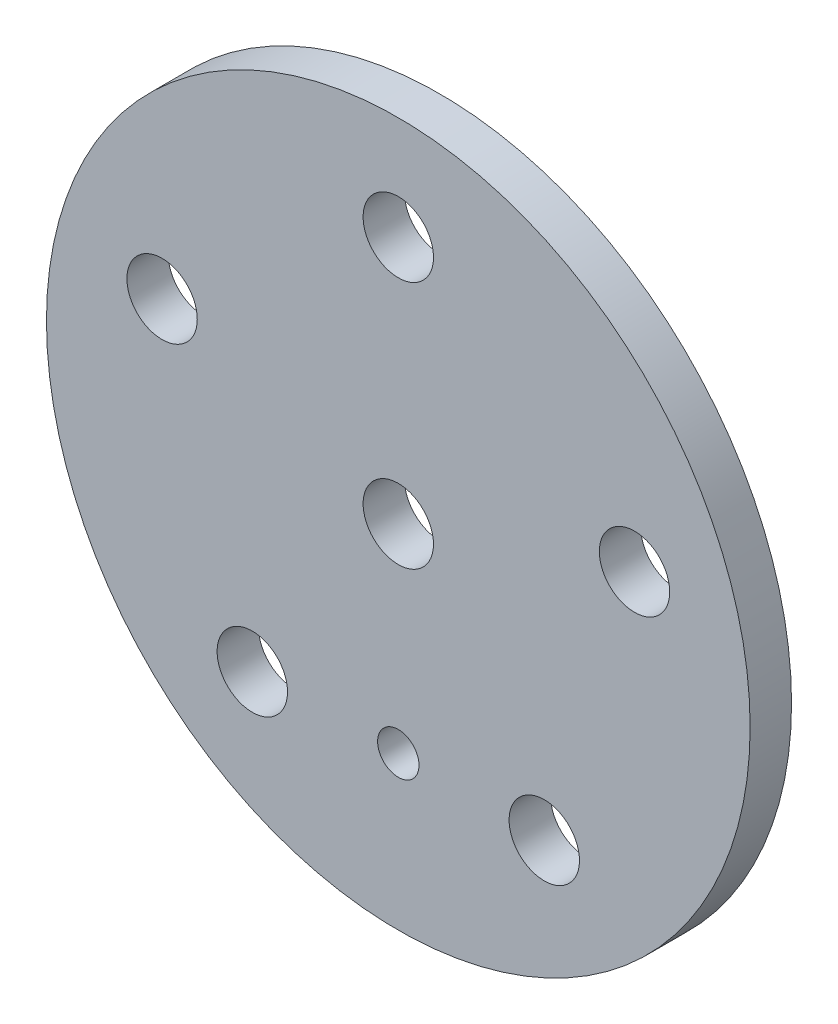
ISO-10303-21;
HEADER;
FILE_DESCRIPTION(('STEP AP214'),'2;1');
FILE_NAME('part.step','',(''),(''),'','','');
FILE_SCHEMA(('AUTOMOTIVE_DESIGN { 1 0 10303 214 1 1 1 1 }'));
ENDSEC;
DATA;
#1=APPLICATION_CONTEXT('core data for automotive mechanical design processes');
#2=APPLICATION_PROTOCOL_DEFINITION('international standard','automotive_design',2000,#1);
#3=PRODUCT_CONTEXT('',#1,'mechanical');
#4=PRODUCT('Part','Part','',(#3));
#5=PRODUCT_RELATED_PRODUCT_CATEGORY('part','',(#4));
#6=PRODUCT_DEFINITION_FORMATION('','',#4);
#7=PRODUCT_DEFINITION_CONTEXT('part definition',#1,'design');
#8=PRODUCT_DEFINITION('design','',#6,#7);
#9=PRODUCT_DEFINITION_SHAPE('','',#8);
#10=(LENGTH_UNIT() NAMED_UNIT(*) SI_UNIT(.MILLI.,.METRE.));
#11=(NAMED_UNIT(*) PLANE_ANGLE_UNIT() SI_UNIT($,.RADIAN.));
#12=(NAMED_UNIT(*) SI_UNIT($,.STERADIAN.) SOLID_ANGLE_UNIT());
#13=UNCERTAINTY_MEASURE_WITH_UNIT(LENGTH_MEASURE(1.E-05),#10,'distance_accuracy_value','');
#14=(GEOMETRIC_REPRESENTATION_CONTEXT(3) GLOBAL_UNCERTAINTY_ASSIGNED_CONTEXT((#13)) GLOBAL_UNIT_ASSIGNED_CONTEXT((#10,
#11,#12)) REPRESENTATION_CONTEXT('',''));
#15=CARTESIAN_POINT('',(0.,0.,0.));
#16=DIRECTION('',(0.,0.,1.));
#17=DIRECTION('',(1.,0.,0.));
#18=AXIS2_PLACEMENT_3D('',#15,#16,#17);
#19=CARTESIAN_POINT('',(0.,0.,10.));
#20=DIRECTION('',(0.,0.,1.));
#21=DIRECTION('',(1.,0.,0.));
#22=AXIS2_PLACEMENT_3D('',#19,#20,#21);
#23=PLANE('',#22);
#24=CARTESIAN_POINT('',(0.,-48.,10.));
#25=DIRECTION('',(0.,0.,1.));
#26=DIRECTION('',(1.,0.,0.));
#27=AXIS2_PLACEMENT_3D('',#24,#25,#26);
#28=CIRCLE('',#27,5.);
#29=CARTESIAN_POINT('',(5.,-48.,10.));
#30=VERTEX_POINT('',#29);
#31=EDGE_CURVE('E84',#30,#30,#28,.T.);
#32=ORIENTED_EDGE('',*,*,#31,.F.);
#33=EDGE_LOOP('',(#32));
#34=FACE_BOUND('',#33,.T.);
#35=CARTESIAN_POINT('',(0.,60.,10.));
#36=DIRECTION('',(0.,0.,1.));
#37=DIRECTION('',(1.,0.,0.));
#38=AXIS2_PLACEMENT_3D('',#35,#36,#37);
#39=CIRCLE('',#38,8.5);
#40=CARTESIAN_POINT('',(8.5,60.,10.));
#41=VERTEX_POINT('',#40);
#42=EDGE_CURVE('E79',#41,#41,#39,.T.);
#43=ORIENTED_EDGE('',*,*,#42,.F.);
#44=EDGE_LOOP('',(#43));
#45=FACE_BOUND('',#44,.T.);
#46=CARTESIAN_POINT('',(57.0633909777107,18.5410196624989,10.));
#47=DIRECTION('',(0.,0.,1.));
#48=DIRECTION('',(1.,0.,0.));
#49=AXIS2_PLACEMENT_3D('',#46,#47,#48);
#50=CIRCLE('',#49,8.5);
#51=CARTESIAN_POINT('',(65.5633909777107,18.5410196624989,10.));
#52=VERTEX_POINT('',#51);
#53=EDGE_CURVE('E73',#52,#52,#50,.T.);
#54=ORIENTED_EDGE('',*,*,#53,.F.);
#55=EDGE_LOOP('',(#54));
#56=FACE_BOUND('',#55,.T.);
#57=CARTESIAN_POINT('',(35.2671151375522,-48.5410196624956,10.));
#58=DIRECTION('',(0.,0.,1.));
#59=DIRECTION('',(1.,0.,0.));
#60=AXIS2_PLACEMENT_3D('',#57,#58,#59);
#61=CIRCLE('',#60,8.5);
#62=CARTESIAN_POINT('',(43.7671151375522,-48.5410196624956,10.));
#63=VERTEX_POINT('',#62);
#64=EDGE_CURVE('E67',#63,#63,#61,.T.);
#65=ORIENTED_EDGE('',*,*,#64,.F.);
#66=EDGE_LOOP('',(#65));
#67=FACE_BOUND('',#66,.T.);
#68=CARTESIAN_POINT('',(-35.2671151375445,-48.5410196624981,10.));
#69=DIRECTION('',(0.,0.,1.));
#70=DIRECTION('',(1.,0.,0.));
#71=AXIS2_PLACEMENT_3D('',#68,#69,#70);
#72=CIRCLE('',#71,8.5);
#73=CARTESIAN_POINT('',(-26.7671151375445,-48.5410196624981,10.));
#74=VERTEX_POINT('',#73);
#75=EDGE_CURVE('E61',#74,#74,#72,.T.);
#76=ORIENTED_EDGE('',*,*,#75,.F.);
#77=EDGE_LOOP('',(#76));
#78=FACE_BOUND('',#77,.T.);
#79=CARTESIAN_POINT('',(-57.0633909777077,18.5410196624948,10.));
#80=DIRECTION('',(0.,0.,1.));
#81=DIRECTION('',(1.,0.,0.));
#82=AXIS2_PLACEMENT_3D('',#79,#80,#81);
#83=CIRCLE('',#82,8.5);
#84=CARTESIAN_POINT('',(-48.5633909777077,18.5410196624948,10.));
#85=VERTEX_POINT('',#84);
#86=EDGE_CURVE('E55',#85,#85,#83,.T.);
#87=ORIENTED_EDGE('',*,*,#86,.F.);
#88=EDGE_LOOP('',(#87));
#89=FACE_BOUND('',#88,.T.);
#90=CARTESIAN_POINT('',(0.,0.,10.));
#91=DIRECTION('',(0.,0.,1.));
#92=DIRECTION('',(1.,0.,0.));
#93=AXIS2_PLACEMENT_3D('',#90,#91,#92);
#94=CIRCLE('',#93,85.);
#95=CARTESIAN_POINT('',(85.,0.,10.));
#96=VERTEX_POINT('',#95);
#97=EDGE_CURVE('E10',#96,#96,#94,.T.);
#98=ORIENTED_EDGE('',*,*,#97,.T.);
#99=EDGE_LOOP('',(#98));
#100=FACE_BOUND('',#99,.T.);
#101=CARTESIAN_POINT('',(0.,0.,10.));
#102=DIRECTION('',(0.,0.,1.));
#103=DIRECTION('',(1.,0.,0.));
#104=AXIS2_PLACEMENT_3D('',#101,#102,#103);
#105=CIRCLE('',#104,8.5);
#106=CARTESIAN_POINT('',(8.5,0.,10.));
#107=VERTEX_POINT('',#106);
#108=EDGE_CURVE('E47',#107,#107,#105,.T.);
#109=ORIENTED_EDGE('',*,*,#108,.F.);
#110=EDGE_LOOP('',(#109));
#111=FACE_BOUND('',#110,.T.);
#112=ADVANCED_FACE('F34',(#34,#45,#56,#67,#78,#89,#100,#111),#23,.T.);
#113=CARTESIAN_POINT('',(0.,0.,0.));
#114=DIRECTION('',(0.,0.,1.));
#115=DIRECTION('',(1.,0.,0.));
#116=AXIS2_PLACEMENT_3D('',#113,#114,#115);
#117=PLANE('',#116);
#118=CARTESIAN_POINT('',(0.,-48.,0.));
#119=DIRECTION('',(0.,0.,1.));
#120=DIRECTION('',(1.,0.,0.));
#121=AXIS2_PLACEMENT_3D('',#118,#119,#120);
#122=CIRCLE('',#121,5.);
#123=CARTESIAN_POINT('',(5.,-48.,0.));
#124=VERTEX_POINT('',#123);
#125=EDGE_CURVE('E38',#124,#124,#122,.T.);
#126=ORIENTED_EDGE('',*,*,#125,.T.);
#127=EDGE_LOOP('',(#126));
#128=FACE_BOUND('',#127,.T.);
#129=CARTESIAN_POINT('',(0.,60.,0.));
#130=DIRECTION('',(0.,0.,1.));
#131=DIRECTION('',(1.,0.,0.));
#132=AXIS2_PLACEMENT_3D('',#129,#130,#131);
#133=CIRCLE('',#132,8.5);
#134=CARTESIAN_POINT('',(8.5,60.,0.));
#135=VERTEX_POINT('',#134);
#136=EDGE_CURVE('E52',#135,#135,#133,.T.);
#137=ORIENTED_EDGE('',*,*,#136,.T.);
#138=EDGE_LOOP('',(#137));
#139=FACE_BOUND('',#138,.T.);
#140=CARTESIAN_POINT('',(57.0633909777107,18.5410196624989,0.));
#141=DIRECTION('',(0.,0.,1.));
#142=DIRECTION('',(1.,0.,0.));
#143=AXIS2_PLACEMENT_3D('',#140,#141,#142);
#144=CIRCLE('',#143,8.5);
#145=CARTESIAN_POINT('',(65.5633909777107,18.5410196624989,0.));
#146=VERTEX_POINT('',#145);
#147=EDGE_CURVE('E76',#146,#146,#144,.T.);
#148=ORIENTED_EDGE('',*,*,#147,.T.);
#149=EDGE_LOOP('',(#148));
#150=FACE_BOUND('',#149,.T.);
#151=CARTESIAN_POINT('',(35.2671151375522,-48.5410196624956,0.));
#152=DIRECTION('',(0.,0.,1.));
#153=DIRECTION('',(1.,0.,0.));
#154=AXIS2_PLACEMENT_3D('',#151,#152,#153);
#155=CIRCLE('',#154,8.5);
#156=CARTESIAN_POINT('',(43.7671151375522,-48.5410196624956,0.));
#157=VERTEX_POINT('',#156);
#158=EDGE_CURVE('E70',#157,#157,#155,.T.);
#159=ORIENTED_EDGE('',*,*,#158,.T.);
#160=EDGE_LOOP('',(#159));
#161=FACE_BOUND('',#160,.T.);
#162=CARTESIAN_POINT('',(-35.2671151375445,-48.5410196624981,0.));
#163=DIRECTION('',(0.,0.,1.));
#164=DIRECTION('',(1.,0.,0.));
#165=AXIS2_PLACEMENT_3D('',#162,#163,#164);
#166=CIRCLE('',#165,8.5);
#167=CARTESIAN_POINT('',(-26.7671151375445,-48.5410196624981,0.));
#168=VERTEX_POINT('',#167);
#169=EDGE_CURVE('E64',#168,#168,#166,.T.);
#170=ORIENTED_EDGE('',*,*,#169,.T.);
#171=EDGE_LOOP('',(#170));
#172=FACE_BOUND('',#171,.T.);
#173=CARTESIAN_POINT('',(-57.0633909777077,18.5410196624948,0.));
#174=DIRECTION('',(0.,0.,1.));
#175=DIRECTION('',(1.,0.,0.));
#176=AXIS2_PLACEMENT_3D('',#173,#174,#175);
#177=CIRCLE('',#176,8.5);
#178=CARTESIAN_POINT('',(-48.5633909777077,18.5410196624948,0.));
#179=VERTEX_POINT('',#178);
#180=EDGE_CURVE('E58',#179,#179,#177,.T.);
#181=ORIENTED_EDGE('',*,*,#180,.T.);
#182=EDGE_LOOP('',(#181));
#183=FACE_BOUND('',#182,.T.);
#184=CARTESIAN_POINT('',(0.,0.,0.));
#185=DIRECTION('',(0.,0.,1.));
#186=DIRECTION('',(1.,0.,0.));
#187=AXIS2_PLACEMENT_3D('',#184,#185,#186);
#188=CIRCLE('',#187,85.);
#189=CARTESIAN_POINT('',(85.,0.,0.));
#190=VERTEX_POINT('',#189);
#191=EDGE_CURVE('E42',#190,#190,#188,.T.);
#192=ORIENTED_EDGE('',*,*,#191,.F.);
#193=EDGE_LOOP('',(#192));
#194=FACE_BOUND('',#193,.T.);
#195=CARTESIAN_POINT('',(0.,0.,0.));
#196=DIRECTION('',(0.,0.,1.));
#197=DIRECTION('',(1.,0.,0.));
#198=AXIS2_PLACEMENT_3D('',#195,#196,#197);
#199=CIRCLE('',#198,8.5);
#200=CARTESIAN_POINT('',(8.5,0.,0.));
#201=VERTEX_POINT('',#200);
#202=EDGE_CURVE('E49',#201,#201,#199,.T.);
#203=ORIENTED_EDGE('',*,*,#202,.T.);
#204=EDGE_LOOP('',(#203));
#205=FACE_BOUND('',#204,.T.);
#206=ADVANCED_FACE('F91',(#128,#139,#150,#161,#172,#183,#194,#205),#117,.F.);
#207=CARTESIAN_POINT('',(0.,0.,10.));
#208=DIRECTION('',(0.,0.,-1.));
#209=DIRECTION('',(-1.,0.,0.));
#210=AXIS2_PLACEMENT_3D('',#207,#208,#209);
#211=CYLINDRICAL_SURFACE('',#210,85.);
#212=ORIENTED_EDGE('',*,*,#97,.F.);
#213=EDGE_LOOP('',(#212));
#214=FACE_BOUND('',#213,.T.);
#215=ORIENTED_EDGE('',*,*,#191,.T.);
#216=EDGE_LOOP('',(#215));
#217=FACE_BOUND('',#216,.T.);
#218=ADVANCED_FACE('F36',(#214,#217),#211,.T.);
#219=CARTESIAN_POINT('',(0.,0.,10.));
#220=DIRECTION('',(0.,0.,-1.));
#221=DIRECTION('',(-1.,0.,0.));
#222=AXIS2_PLACEMENT_3D('',#219,#220,#221);
#223=CYLINDRICAL_SURFACE('',#222,8.5);
#224=ORIENTED_EDGE('',*,*,#108,.T.);
#225=EDGE_LOOP('',(#224));
#226=FACE_BOUND('',#225,.T.);
#227=ORIENTED_EDGE('',*,*,#202,.F.);
#228=EDGE_LOOP('',(#227));
#229=FACE_BOUND('',#228,.T.);
#230=ADVANCED_FACE('F112',(#226,#229),#223,.F.);
#231=CARTESIAN_POINT('',(-57.0633909777077,18.5410196624948,0.));
#232=DIRECTION('',(0.,0.,1.));
#233=DIRECTION('',(1.,0.,0.));
#234=AXIS2_PLACEMENT_3D('',#231,#232,#233);
#235=CYLINDRICAL_SURFACE('',#234,8.5);
#236=ORIENTED_EDGE('',*,*,#180,.F.);
#237=EDGE_LOOP('',(#236));
#238=FACE_BOUND('',#237,.T.);
#239=ORIENTED_EDGE('',*,*,#86,.T.);
#240=EDGE_LOOP('',(#239));
#241=FACE_BOUND('',#240,.T.);
#242=ADVANCED_FACE('F115',(#238,#241),#235,.F.);
#243=CARTESIAN_POINT('',(-35.2671151375445,-48.5410196624981,0.));
#244=DIRECTION('',(0.,0.,1.));
#245=DIRECTION('',(1.,0.,0.));
#246=AXIS2_PLACEMENT_3D('',#243,#244,#245);
#247=CYLINDRICAL_SURFACE('',#246,8.5);
#248=ORIENTED_EDGE('',*,*,#169,.F.);
#249=EDGE_LOOP('',(#248));
#250=FACE_BOUND('',#249,.T.);
#251=ORIENTED_EDGE('',*,*,#75,.T.);
#252=EDGE_LOOP('',(#251));
#253=FACE_BOUND('',#252,.T.);
#254=ADVANCED_FACE('F119',(#250,#253),#247,.F.);
#255=CARTESIAN_POINT('',(35.2671151375522,-48.5410196624956,0.));
#256=DIRECTION('',(0.,0.,1.));
#257=DIRECTION('',(1.,0.,0.));
#258=AXIS2_PLACEMENT_3D('',#255,#256,#257);
#259=CYLINDRICAL_SURFACE('',#258,8.5);
#260=ORIENTED_EDGE('',*,*,#158,.F.);
#261=EDGE_LOOP('',(#260));
#262=FACE_BOUND('',#261,.T.);
#263=ORIENTED_EDGE('',*,*,#64,.T.);
#264=EDGE_LOOP('',(#263));
#265=FACE_BOUND('',#264,.T.);
#266=ADVANCED_FACE('F123',(#262,#265),#259,.F.);
#267=CARTESIAN_POINT('',(57.0633909777107,18.5410196624989,0.));
#268=DIRECTION('',(0.,0.,1.));
#269=DIRECTION('',(1.,0.,0.));
#270=AXIS2_PLACEMENT_3D('',#267,#268,#269);
#271=CYLINDRICAL_SURFACE('',#270,8.5);
#272=ORIENTED_EDGE('',*,*,#147,.F.);
#273=EDGE_LOOP('',(#272));
#274=FACE_BOUND('',#273,.T.);
#275=ORIENTED_EDGE('',*,*,#53,.T.);
#276=EDGE_LOOP('',(#275));
#277=FACE_BOUND('',#276,.T.);
#278=ADVANCED_FACE('F101',(#274,#277),#271,.F.);
#279=CARTESIAN_POINT('',(0.,60.,0.));
#280=DIRECTION('',(0.,0.,1.));
#281=DIRECTION('',(1.,0.,0.));
#282=AXIS2_PLACEMENT_3D('',#279,#280,#281);
#283=CYLINDRICAL_SURFACE('',#282,8.5);
#284=ORIENTED_EDGE('',*,*,#136,.F.);
#285=EDGE_LOOP('',(#284));
#286=FACE_BOUND('',#285,.T.);
#287=ORIENTED_EDGE('',*,*,#42,.T.);
#288=EDGE_LOOP('',(#287));
#289=FACE_BOUND('',#288,.T.);
#290=ADVANCED_FACE('F96',(#286,#289),#283,.F.);
#291=CARTESIAN_POINT('',(0.,-48.,-50.));
#292=DIRECTION('',(0.,0.,1.));
#293=DIRECTION('',(1.,0.,0.));
#294=AXIS2_PLACEMENT_3D('',#291,#292,#293);
#295=CYLINDRICAL_SURFACE('',#294,5.);
#296=CARTESIAN_POINT('',(5.,-48.,10.));
#297=CARTESIAN_POINT('',(5.,-48.,9.89583333333333));
#298=CARTESIAN_POINT('',(5.,-48.,9.79166666666667));
#299=CARTESIAN_POINT('',(5.,-48.,9.58333333333333));
#300=CARTESIAN_POINT('',(5.,-48.,9.47916666666667));
#301=CARTESIAN_POINT('',(5.,-48.,9.27083333333333));
#302=CARTESIAN_POINT('',(5.,-48.,9.16666666666667));
#303=CARTESIAN_POINT('',(5.,-48.,8.95833333333333));
#304=CARTESIAN_POINT('',(5.,-48.,8.85416666666667));
#305=CARTESIAN_POINT('',(5.,-48.,8.64583333333333));
#306=CARTESIAN_POINT('',(5.,-48.,8.54166666666667));
#307=CARTESIAN_POINT('',(5.,-48.,8.33333333333333));
#308=CARTESIAN_POINT('',(5.,-48.,8.22916666666667));
#309=CARTESIAN_POINT('',(5.,-48.,8.02083333333333));
#310=CARTESIAN_POINT('',(5.,-48.,7.91666666666667));
#311=CARTESIAN_POINT('',(5.,-48.,7.70833333333333));
#312=CARTESIAN_POINT('',(5.,-48.,7.60416666666667));
#313=CARTESIAN_POINT('',(5.,-48.,7.39583333333333));
#314=CARTESIAN_POINT('',(5.,-48.,7.29166666666667));
#315=CARTESIAN_POINT('',(5.,-48.,7.08333333333333));
#316=CARTESIAN_POINT('',(5.,-48.,6.97916666666667));
#317=CARTESIAN_POINT('',(5.,-48.,6.77083333333333));
#318=CARTESIAN_POINT('',(5.,-48.,6.66666666666667));
#319=CARTESIAN_POINT('',(5.,-48.,6.45833333333333));
#320=CARTESIAN_POINT('',(5.,-48.,6.35416666666667));
#321=CARTESIAN_POINT('',(5.,-48.,6.14583333333333));
#322=CARTESIAN_POINT('',(5.,-48.,6.04166666666667));
#323=CARTESIAN_POINT('',(5.,-48.,5.83333333333333));
#324=CARTESIAN_POINT('',(5.,-48.,5.72916666666666));
#325=CARTESIAN_POINT('',(5.,-48.,5.52083333333333));
#326=CARTESIAN_POINT('',(5.,-48.,5.41666666666666));
#327=CARTESIAN_POINT('',(5.,-48.,5.20833333333333));
#328=CARTESIAN_POINT('',(5.,-48.,5.10416666666666));
#329=CARTESIAN_POINT('',(5.,-48.,4.89583333333333));
#330=CARTESIAN_POINT('',(5.,-48.,4.79166666666666));
#331=CARTESIAN_POINT('',(5.,-48.,4.58333333333333));
#332=CARTESIAN_POINT('',(5.,-48.,4.47916666666666));
#333=CARTESIAN_POINT('',(5.,-48.,4.27083333333333));
#334=CARTESIAN_POINT('',(5.,-48.,4.16666666666666));
#335=CARTESIAN_POINT('',(5.,-48.,3.95833333333333));
#336=CARTESIAN_POINT('',(5.,-48.,3.85416666666666));
#337=CARTESIAN_POINT('',(5.,-48.,3.64583333333333));
#338=CARTESIAN_POINT('',(5.,-48.,3.54166666666666));
#339=CARTESIAN_POINT('',(5.,-48.,3.33333333333333));
#340=CARTESIAN_POINT('',(5.,-48.,3.22916666666666));
#341=CARTESIAN_POINT('',(5.,-48.,3.02083333333333));
#342=CARTESIAN_POINT('',(5.,-48.,2.91666666666666));
#343=CARTESIAN_POINT('',(5.,-48.,2.70833333333333));
#344=CARTESIAN_POINT('',(5.,-48.,2.60416666666666));
#345=CARTESIAN_POINT('',(5.,-48.,2.39583333333333));
#346=CARTESIAN_POINT('',(5.,-48.,2.29166666666666));
#347=CARTESIAN_POINT('',(5.,-48.,2.08333333333333));
#348=CARTESIAN_POINT('',(5.,-48.,1.97916666666666));
#349=CARTESIAN_POINT('',(5.,-48.,1.77083333333333));
#350=CARTESIAN_POINT('',(5.,-48.,1.66666666666666));
#351=CARTESIAN_POINT('',(5.,-48.,1.45833333333333));
#352=CARTESIAN_POINT('',(5.,-48.,1.35416666666666));
#353=CARTESIAN_POINT('',(5.,-48.,1.14583333333333));
#354=CARTESIAN_POINT('',(5.,-48.,1.04166666666666));
#355=CARTESIAN_POINT('',(5.,-48.,0.833333333333327));
#356=CARTESIAN_POINT('',(5.,-48.,0.72916666666666));
#357=CARTESIAN_POINT('',(5.,-48.,0.520833333333327));
#358=CARTESIAN_POINT('',(5.,-48.,0.41666666666666));
#359=CARTESIAN_POINT('',(5.,-48.,0.208333333333327));
#360=CARTESIAN_POINT('',(5.,-48.,0.10416666666666));
#361=CARTESIAN_POINT('',(5.,-48.,0.));
#362=B_SPLINE_CURVE_WITH_KNOTS('',3,(#296,#297,#298,#299,#300,#301,#302,#303,#304,#305,#306,
#307,#308,#309,#310,#311,#312,#313,#314,#315,#316,#317,#318,#319,#320,#321,#322,#323,#324,#325,
#326,#327,#328,#329,#330,#331,#332,#333,#334,#335,#336,#337,#338,#339,#340,#341,#342,#343,#344,
#345,#346,#347,#348,#349,#350,#351,#352,#353,#354,#355,#356,#357,#358,#359,#360,#361),
.UNSPECIFIED.,.F.,.F.,(4,2,2,2,2,2,2,2,2,2,2,2,2,2,2,2,2,2,2,2,2,2,2,2,2,2,2,2,2,2,2,2,4),(0.,
0.3125,0.625000000000001,0.937500000000001,1.25,1.5625,1.875,2.1875,2.5,2.8125,3.125,3.4375,
3.75,4.0625,4.375,4.6875,5.,5.3125,5.62500000000001,5.93750000000001,6.25000000000001,
6.56250000000001,6.87500000000001,7.18750000000001,7.50000000000001,7.81250000000001,
8.12500000000001,8.43750000000001,8.75000000000001,9.06250000000001,9.37500000000001,
9.68750000000001,10.),.UNSPECIFIED.);
#363=EDGE_CURVE('BSEAM94',#30,#124,#362,.T.);
#364=ORIENTED_EDGE('',*,*,#31,.T.);
#365=ORIENTED_EDGE('',*,*,#125,.F.);
#366=ORIENTED_EDGE('',*,*,#363,.T.);
#367=ORIENTED_EDGE('',*,*,#363,.F.);
#368=EDGE_LOOP('',(#364,#366,#365,#367));
#369=FACE_BOUND('',#368,.T.);
#370=ADVANCED_FACE('F94',(#369),#295,.F.);
#371=CLOSED_SHELL('',(#112,#206,#218,#230,#242,#254,#266,#278,#290,#370));
#372=MANIFOLD_SOLID_BREP('B2',#371);
#373=ADVANCED_BREP_SHAPE_REPRESENTATION('',(#18,#372),#14);
#374=SHAPE_DEFINITION_REPRESENTATION(#9,#373);
ENDSEC;
END-ISO-10303-21;
